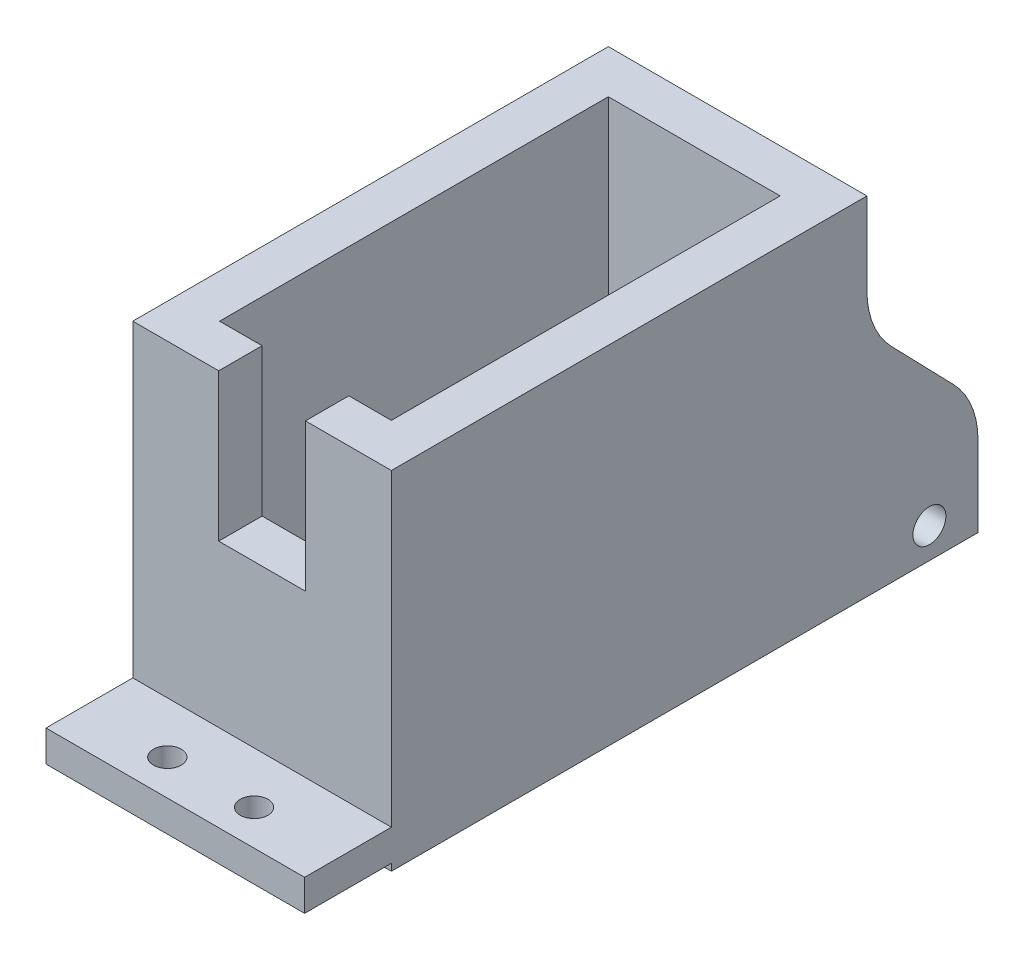
ISO-10303-21;
HEADER;
FILE_DESCRIPTION(('STEP AP214'),'2;1');
FILE_NAME('part.step','',(''),(''),'','','');
FILE_SCHEMA(('AUTOMOTIVE_DESIGN { 1 0 10303 214 1 1 1 1 }'));
ENDSEC;
DATA;
#1=APPLICATION_CONTEXT('core data for automotive mechanical design processes');
#2=APPLICATION_PROTOCOL_DEFINITION('international standard','automotive_design',2000,#1);
#3=PRODUCT_CONTEXT('',#1,'mechanical');
#4=PRODUCT('Part','Part','',(#3));
#5=PRODUCT_RELATED_PRODUCT_CATEGORY('part','',(#4));
#6=PRODUCT_DEFINITION_FORMATION('','',#4);
#7=PRODUCT_DEFINITION_CONTEXT('part definition',#1,'design');
#8=PRODUCT_DEFINITION('design','',#6,#7);
#9=PRODUCT_DEFINITION_SHAPE('','',#8);
#10=(LENGTH_UNIT() NAMED_UNIT(*) SI_UNIT(.MILLI.,.METRE.));
#11=(NAMED_UNIT(*) PLANE_ANGLE_UNIT() SI_UNIT($,.RADIAN.));
#12=(NAMED_UNIT(*) SI_UNIT($,.STERADIAN.) SOLID_ANGLE_UNIT());
#13=UNCERTAINTY_MEASURE_WITH_UNIT(LENGTH_MEASURE(1.E-05),#10,'distance_accuracy_value','');
#14=(GEOMETRIC_REPRESENTATION_CONTEXT(3) GLOBAL_UNCERTAINTY_ASSIGNED_CONTEXT((#13)) GLOBAL_UNIT_ASSIGNED_CONTEXT((#10,
#11,#12)) REPRESENTATION_CONTEXT('',''));
#15=CARTESIAN_POINT('',(0.,0.,0.));
#16=DIRECTION('',(0.,0.,1.));
#17=DIRECTION('',(1.,0.,0.));
#18=AXIS2_PLACEMENT_3D('',#15,#16,#17);
#19=CARTESIAN_POINT('',(0.,50.8,-6.78299136069114));
#20=DIRECTION('',(0.,0.,1.));
#21=DIRECTION('',(1.,0.,0.));
#22=AXIS2_PLACEMENT_3D('',#19,#20,#21);
#23=PLANE('',#22);
#24=DIRECTION('',(0.,-1.,0.));
#25=VECTOR('',#24,1.);
#26=CARTESIAN_POINT('',(30.9678574514039,50.8,-6.78299136069115));
#27=LINE('',#26,#25);
#28=CARTESIAN_POINT('',(30.9678574514039,50.8,-6.78299136069115));
#29=VERTEX_POINT('',#28);
#30=CARTESIAN_POINT('',(30.9678574514039,38.7776741231466,-6.78299136069115));
#31=VERTEX_POINT('',#30);
#32=EDGE_CURVE('E366',#29,#31,#27,.T.);
#33=ORIENTED_EDGE('',*,*,#32,.T.);
#34=DIRECTION('',(1.,0.,0.));
#35=VECTOR('',#34,1.);
#36=CARTESIAN_POINT('',(0.,38.7776741231466,-6.78299136069114));
#37=LINE('',#36,#35);
#38=CARTESIAN_POINT('',(-6.87814254859611,38.7776741231466,-6.78299136069114));
#39=VERTEX_POINT('',#38);
#40=EDGE_CURVE('E61',#31,#39,#37,.F.);
#41=ORIENTED_EDGE('',*,*,#40,.T.);
#42=DIRECTION('',(0.,-1.,0.));
#43=VECTOR('',#42,1.);
#44=CARTESIAN_POINT('',(-6.87814254859611,50.8,-6.78299136069114));
#45=LINE('',#44,#43);
#46=CARTESIAN_POINT('',(-6.87814254859611,50.8,-6.78299136069114));
#47=VERTEX_POINT('',#46);
#48=EDGE_CURVE('E385',#47,#39,#45,.T.);
#49=ORIENTED_EDGE('',*,*,#48,.F.);
#50=DIRECTION('',(-1.,0.,0.));
#51=VECTOR('',#50,1.);
#52=CARTESIAN_POINT('',(0.,50.8,-6.78299136069114));
#53=LINE('',#52,#51);
#54=EDGE_CURVE('E313',#29,#47,#53,.T.);
#55=ORIENTED_EDGE('',*,*,#54,.F.);
#56=EDGE_LOOP('',(#33,#41,#49,#55));
#57=FACE_BOUND('',#56,.T.);
#58=ADVANCED_FACE('F45',(#57),#23,.F.);
#59=CARTESIAN_POINT('',(0.,50.8,62.8130086393089));
#60=DIRECTION('',(0.,0.,-1.));
#61=DIRECTION('',(-1.,0.,0.));
#62=AXIS2_PLACEMENT_3D('',#59,#60,#61);
#63=PLANE('',#62);
#64=DIRECTION('',(1.,0.,0.));
#65=VECTOR('',#64,1.);
#66=CARTESIAN_POINT('',(0.,1.016,62.8130086393089));
#67=LINE('',#66,#65);
#68=CARTESIAN_POINT('',(-6.87814254859611,1.016,62.8130086393089));
#69=VERTEX_POINT('',#68);
#70=CARTESIAN_POINT('',(30.9678574514039,1.016,62.8130086393089));
#71=VERTEX_POINT('',#70);
#72=EDGE_CURVE('E264',#69,#71,#67,.T.);
#73=ORIENTED_EDGE('',*,*,#72,.F.);
#74=DIRECTION('',(0.,-1.,0.));
#75=VECTOR('',#74,1.);
#76=CARTESIAN_POINT('',(-6.8781425485961,50.8,62.8130086393089));
#77=LINE('',#76,#75);
#78=CARTESIAN_POINT('',(-6.8781425485961,0.,62.8130086393089));
#79=VERTEX_POINT('',#78);
#80=EDGE_CURVE('E380',#69,#79,#77,.T.);
#81=ORIENTED_EDGE('',*,*,#80,.T.);
#82=DIRECTION('',(1.,0.,0.));
#83=VECTOR('',#82,1.);
#84=CARTESIAN_POINT('',(0.,0.,62.8130086393089));
#85=LINE('',#84,#83);
#86=CARTESIAN_POINT('',(30.9678574514039,0.,62.8130086393089));
#87=VERTEX_POINT('',#86);
#88=EDGE_CURVE('E211',#79,#87,#85,.T.);
#89=ORIENTED_EDGE('',*,*,#88,.T.);
#90=DIRECTION('',(0.,-1.,0.));
#91=VECTOR('',#90,1.);
#92=CARTESIAN_POINT('',(30.9678574514039,50.8,62.8130086393089));
#93=LINE('',#92,#91);
#94=EDGE_CURVE('E342',#71,#87,#93,.T.);
#95=ORIENTED_EDGE('',*,*,#94,.F.);
#96=EDGE_LOOP('',(#73,#81,#89,#95));
#97=FACE_BOUND('',#96,.T.);
#98=ADVANCED_FACE('F430',(#97),#63,.F.);
#99=CARTESIAN_POINT('',(0.,50.8,-0.432991360691145));
#100=DIRECTION('',(0.,0.,1.));
#101=DIRECTION('',(1.,0.,0.));
#102=AXIS2_PLACEMENT_3D('',#99,#100,#101);
#103=PLANE('',#102);
#104=DIRECTION('',(-1.,0.,0.));
#105=VECTOR('',#104,1.);
#106=CARTESIAN_POINT('',(0.,0.,-0.432991360691145));
#107=LINE('',#106,#105);
#108=CARTESIAN_POINT('',(24.6178574514039,0.,-0.432991360691145));
#109=VERTEX_POINT('',#108);
#110=CARTESIAN_POINT('',(-0.528142548596113,0.,-0.432991360691145));
#111=VERTEX_POINT('',#110);
#112=EDGE_CURVE('E347',#109,#111,#107,.T.);
#113=ORIENTED_EDGE('',*,*,#112,.F.);
#114=DIRECTION('',(0.,-1.,0.));
#115=VECTOR('',#114,1.);
#116=CARTESIAN_POINT('',(24.6178574514039,50.8,-0.432991360691145));
#117=LINE('',#116,#115);
#118=CARTESIAN_POINT('',(24.6178574514039,50.8,-0.432991360691145));
#119=VERTEX_POINT('',#118);
#120=EDGE_CURVE('E372',#119,#109,#117,.T.);
#121=ORIENTED_EDGE('',*,*,#120,.F.);
#122=DIRECTION('',(-1.,0.,0.));
#123=VECTOR('',#122,1.);
#124=CARTESIAN_POINT('',(0.,50.8,-0.432991360691145));
#125=LINE('',#124,#123);
#126=CARTESIAN_POINT('',(-0.528142548596113,50.8,-0.432991360691145));
#127=VERTEX_POINT('',#126);
#128=EDGE_CURVE('E325',#119,#127,#125,.T.);
#129=ORIENTED_EDGE('',*,*,#128,.T.);
#130=DIRECTION('',(0.,-1.,0.));
#131=VECTOR('',#130,1.);
#132=CARTESIAN_POINT('',(-0.528142548596113,50.8,-0.432991360691145));
#133=LINE('',#132,#131);
#134=EDGE_CURVE('E362',#127,#111,#133,.T.);
#135=ORIENTED_EDGE('',*,*,#134,.T.);
#136=EDGE_LOOP('',(#113,#121,#129,#135));
#137=FACE_BOUND('',#136,.T.);
#138=ADVANCED_FACE('F506',(#137),#103,.T.);
#139=CARTESIAN_POINT('',(24.6178574514039,50.8,0.));
#140=DIRECTION('',(-1.,0.,0.));
#141=DIRECTION('',(0.,0.,1.));
#142=AXIS2_PLACEMENT_3D('',#139,#140,#141);
#143=PLANE('',#142);
#144=DIRECTION('',(0.,0.,-1.));
#145=VECTOR('',#144,1.);
#146=CARTESIAN_POINT('',(24.6178574514039,0.,0.));
#147=LINE('',#146,#145);
#148=CARTESIAN_POINT('',(24.6178574514039,0.,56.4630086393089));
#149=VERTEX_POINT('',#148);
#150=EDGE_CURVE('E351',#149,#109,#147,.T.);
#151=ORIENTED_EDGE('',*,*,#150,.F.);
#152=DIRECTION('',(0.,-1.,0.));
#153=VECTOR('',#152,1.);
#154=CARTESIAN_POINT('',(24.6178574514039,50.8,56.4630086393089));
#155=LINE('',#154,#153);
#156=CARTESIAN_POINT('',(24.6178574514039,50.8,56.4630086393089));
#157=VERTEX_POINT('',#156);
#158=EDGE_CURVE('E369',#157,#149,#155,.T.);
#159=ORIENTED_EDGE('',*,*,#158,.F.);
#160=DIRECTION('',(0.,0.,-1.));
#161=VECTOR('',#160,1.);
#162=CARTESIAN_POINT('',(24.6178574514039,50.8,0.));
#163=LINE('',#162,#161);
#164=EDGE_CURVE('E329',#157,#119,#163,.T.);
#165=ORIENTED_EDGE('',*,*,#164,.T.);
#166=ORIENTED_EDGE('',*,*,#120,.T.);
#167=EDGE_LOOP('',(#151,#159,#165,#166));
#168=FACE_BOUND('',#167,.T.);
#169=ADVANCED_FACE('F478',(#168),#143,.T.);
#170=CARTESIAN_POINT('',(0.,50.8,56.4630086393089));
#171=DIRECTION('',(0.,0.,-1.));
#172=DIRECTION('',(-1.,0.,0.));
#173=AXIS2_PLACEMENT_3D('',#170,#171,#172);
#174=PLANE('',#173);
#175=DIRECTION('',(0.,1.,0.));
#176=VECTOR('',#175,1.);
#177=CARTESIAN_POINT('',(5.69485745140389,50.8,56.4630086393089));
#178=LINE('',#177,#176);
#179=CARTESIAN_POINT('',(5.69485745140389,29.21,56.4630086393089));
#180=VERTEX_POINT('',#179);
#181=CARTESIAN_POINT('',(5.69485745140389,50.8,56.4630086393089));
#182=VERTEX_POINT('',#181);
#183=EDGE_CURVE('E303',#180,#182,#178,.T.);
#184=ORIENTED_EDGE('',*,*,#183,.F.);
#185=DIRECTION('',(-1.,0.,0.));
#186=VECTOR('',#185,1.);
#187=CARTESIAN_POINT('',(0.,29.21,56.4630086393089));
#188=LINE('',#187,#186);
#189=CARTESIAN_POINT('',(18.3948574514039,29.21,56.4630086393089));
#190=VERTEX_POINT('',#189);
#191=EDGE_CURVE('E306',#190,#180,#188,.T.);
#192=ORIENTED_EDGE('',*,*,#191,.F.);
#193=DIRECTION('',(0.,-1.,0.));
#194=VECTOR('',#193,1.);
#195=CARTESIAN_POINT('',(18.3948574514039,50.8,56.4630086393089));
#196=LINE('',#195,#194);
#197=CARTESIAN_POINT('',(18.3948574514039,50.8,56.4630086393089));
#198=VERTEX_POINT('',#197);
#199=EDGE_CURVE('E298',#198,#190,#196,.T.);
#200=ORIENTED_EDGE('',*,*,#199,.F.);
#201=DIRECTION('',(1.,0.,0.));
#202=VECTOR('',#201,1.);
#203=CARTESIAN_POINT('',(0.,50.8,56.4630086393089));
#204=LINE('',#203,#202);
#205=EDGE_CURVE('E333',#198,#157,#204,.T.);
#206=ORIENTED_EDGE('',*,*,#205,.T.);
#207=ORIENTED_EDGE('',*,*,#158,.T.);
#208=DIRECTION('',(1.,0.,0.));
#209=VECTOR('',#208,1.);
#210=CARTESIAN_POINT('',(0.,0.,56.4630086393089));
#211=LINE('',#210,#209);
#212=CARTESIAN_POINT('',(-0.528142548596105,0.,56.4630086393089));
#213=VERTEX_POINT('',#212);
#214=EDGE_CURVE('E355',#213,#149,#211,.T.);
#215=ORIENTED_EDGE('',*,*,#214,.F.);
#216=DIRECTION('',(0.,-1.,0.));
#217=VECTOR('',#216,1.);
#218=CARTESIAN_POINT('',(-0.528142548596105,50.8,56.4630086393089));
#219=LINE('',#218,#217);
#220=CARTESIAN_POINT('',(-0.528142548596105,50.8,56.4630086393089));
#221=VERTEX_POINT('',#220);
#222=EDGE_CURVE('E365',#221,#213,#219,.T.);
#223=ORIENTED_EDGE('',*,*,#222,.F.);
#224=EDGE_CURVE('E334',#221,#182,#204,.T.);
#225=ORIENTED_EDGE('',*,*,#224,.T.);
#226=EDGE_LOOP('',(#184,#192,#200,#206,#207,#215,#223,#225));
#227=FACE_BOUND('',#226,.T.);
#228=ADVANCED_FACE('F466',(#227),#174,.T.);
#229=CARTESIAN_POINT('',(30.9678574514039,50.8,0.));
#230=DIRECTION('',(-1.,0.,0.));
#231=DIRECTION('',(0.,0.,1.));
#232=AXIS2_PLACEMENT_3D('',#229,#230,#231);
#233=PLANE('',#232);
#234=DIRECTION('',(0.,1.,0.));
#235=VECTOR('',#234,1.);
#236=CARTESIAN_POINT('',(30.9678574514039,0.,-23.0375141960479));
#237=LINE('',#236,#235);
#238=CARTESIAN_POINT('',(30.9678574514039,0.,-23.0375141960479));
#239=VERTEX_POINT('',#238);
#240=CARTESIAN_POINT('',(30.9678574514039,11.7189346613455,-23.0375141960479));
#241=VERTEX_POINT('',#240);
#242=EDGE_CURVE('E217',#239,#241,#237,.T.);
#243=ORIENTED_EDGE('',*,*,#242,.T.);
#244=CARTESIAN_POINT('',(30.9678574514039,11.7189346613455,-10.3375141960479));
#245=DIRECTION('',(-1.,0.,0.));
#246=DIRECTION('',(0.,0.,1.));
#247=AXIS2_PLACEMENT_3D('',#244,#245,#246);
#248=CIRCLE('',#247,12.7);
#249=CARTESIAN_POINT('',(30.9678574514039,20.5583319402468,-19.4564535941222));
#250=VERTEX_POINT('',#249);
#251=EDGE_CURVE('E398',#241,#250,#248,.F.);
#252=ORIENTED_EDGE('',*,*,#251,.T.);
#253=DIRECTION('',(0.,0.718026724257814,0.696015533771763));
#254=VECTOR('',#253,1.);
#255=CARTESIAN_POINT('',(30.9678574514039,19.6827430072258,-20.3052012493174));
#256=LINE('',#255,#254);
#257=CARTESIAN_POINT('',(30.9678574514039,29.9382768442452,-10.3640519626169));
#258=VERTEX_POINT('',#257);
#259=EDGE_CURVE('E223',#250,#258,#256,.T.);
#260=ORIENTED_EDGE('',*,*,#259,.T.);
#261=CARTESIAN_POINT('',(30.9678574514039,38.7776741231466,-19.4829913606911));
#262=DIRECTION('',(-1.,0.,0.));
#263=DIRECTION('',(0.,0.,1.));
#264=AXIS2_PLACEMENT_3D('',#261,#262,#263);
#265=CIRCLE('',#264,12.7);
#266=EDGE_CURVE('E54',#258,#31,#265,.T.);
#267=ORIENTED_EDGE('',*,*,#266,.T.);
#268=ORIENTED_EDGE('',*,*,#32,.F.);
#269=DIRECTION('',(0.,0.,-1.));
#270=VECTOR('',#269,1.);
#271=CARTESIAN_POINT('',(30.9678574514039,50.8,0.));
#272=LINE('',#271,#270);
#273=CARTESIAN_POINT('',(30.9678574514039,50.8,62.8130086393089));
#274=VERTEX_POINT('',#273);
#275=EDGE_CURVE('E309',#274,#29,#272,.T.);
#276=ORIENTED_EDGE('',*,*,#275,.F.);
#277=CARTESIAN_POINT('',(30.9678574514039,5.588,62.8130086393089));
#278=VERTEX_POINT('',#277);
#279=EDGE_CURVE('E376',#274,#278,#93,.T.);
#280=ORIENTED_EDGE('',*,*,#279,.T.);
#281=DIRECTION('',(0.,0.,1.));
#282=VECTOR('',#281,1.);
#283=CARTESIAN_POINT('',(30.9678574514039,5.588,0.));
#284=LINE('',#283,#282);
#285=CARTESIAN_POINT('',(30.9678574514039,5.588,75.5130086393089));
#286=VERTEX_POINT('',#285);
#287=EDGE_CURVE('E236',#278,#286,#284,.T.);
#288=ORIENTED_EDGE('',*,*,#287,.T.);
#289=DIRECTION('',(0.,-1.,0.));
#290=VECTOR('',#289,1.);
#291=CARTESIAN_POINT('',(30.9678574514039,5.588,75.5130086393089));
#292=LINE('',#291,#290);
#293=CARTESIAN_POINT('',(30.9678574514039,1.016,75.5130086393089));
#294=VERTEX_POINT('',#293);
#295=EDGE_CURVE('E256',#286,#294,#292,.T.);
#296=ORIENTED_EDGE('',*,*,#295,.T.);
#297=DIRECTION('',(0.,0.,1.));
#298=VECTOR('',#297,1.);
#299=CARTESIAN_POINT('',(30.9678574514039,1.016,0.));
#300=LINE('',#299,#298);
#301=EDGE_CURVE('E260',#71,#294,#300,.T.);
#302=ORIENTED_EDGE('',*,*,#301,.F.);
#303=ORIENTED_EDGE('',*,*,#94,.T.);
#304=DIRECTION('',(0.,0.,-1.));
#305=VECTOR('',#304,1.);
#306=CARTESIAN_POINT('',(30.9678574514039,0.,0.));
#307=LINE('',#306,#305);
#308=EDGE_CURVE('E213',#87,#239,#307,.T.);
#309=ORIENTED_EDGE('',*,*,#308,.T.);
#310=EDGE_LOOP('',(#243,#252,#260,#267,#268,#276,#280,#288,#296,#302,#303,#309));
#311=FACE_BOUND('',#310,.T.);
#312=CARTESIAN_POINT('',(30.9678574514039,4.445,-15.9269913606911));
#313=DIRECTION('',(1.,0.,0.));
#314=DIRECTION('',(0.,0.,-1.));
#315=AXIS2_PLACEMENT_3D('',#312,#313,#314);
#316=CIRCLE('',#315,2.413);
#317=CARTESIAN_POINT('',(30.9678574514039,4.445,-18.3399913606911));
#318=VERTEX_POINT('',#317);
#319=EDGE_CURVE('E219',#318,#318,#316,.T.);
#320=ORIENTED_EDGE('',*,*,#319,.F.);
#321=EDGE_LOOP('',(#320));
#322=FACE_BOUND('',#321,.T.);
#323=ADVANCED_FACE('F414',(#311,#322),#233,.F.);
#324=CARTESIAN_POINT('',(-6.87814254859611,50.8,0.));
#325=DIRECTION('',(1.,0.,0.));
#326=DIRECTION('',(0.,0.,-1.));
#327=AXIS2_PLACEMENT_3D('',#324,#325,#326);
#328=PLANE('',#327);
#329=DIRECTION('',(0.,-0.718026724257814,-0.696015533771763));
#330=VECTOR('',#329,1.);
#331=CARTESIAN_POINT('',(-6.87814254859611,19.6827430072258,-20.3052012493174));
#332=LINE('',#331,#330);
#333=CARTESIAN_POINT('',(-6.87814254859611,29.9382768442452,-10.3640519626169));
#334=VERTEX_POINT('',#333);
#335=CARTESIAN_POINT('',(-6.87814254859611,20.5583319402468,-19.4564535941222));
#336=VERTEX_POINT('',#335);
#337=EDGE_CURVE('E201',#334,#336,#332,.T.);
#338=ORIENTED_EDGE('',*,*,#337,.T.);
#339=CARTESIAN_POINT('',(-6.87814254859611,11.7189346613455,-10.3375141960479));
#340=DIRECTION('',(1.,0.,0.));
#341=DIRECTION('',(0.,0.,-1.));
#342=AXIS2_PLACEMENT_3D('',#339,#340,#341);
#343=CIRCLE('',#342,12.7);
#344=CARTESIAN_POINT('',(-6.87814254859611,11.7189346613455,-23.0375141960479));
#345=VERTEX_POINT('',#344);
#346=EDGE_CURVE('E194',#336,#345,#343,.F.);
#347=ORIENTED_EDGE('',*,*,#346,.T.);
#348=DIRECTION('',(0.,-1.,0.));
#349=VECTOR('',#348,1.);
#350=CARTESIAN_POINT('',(-6.87814254859611,0.,-23.0375141960479));
#351=LINE('',#350,#349);
#352=CARTESIAN_POINT('',(-6.87814254859611,0.,-23.0375141960479));
#353=VERTEX_POINT('',#352);
#354=EDGE_CURVE('E186',#345,#353,#351,.T.);
#355=ORIENTED_EDGE('',*,*,#354,.T.);
#356=DIRECTION('',(0.,0.,1.));
#357=VECTOR('',#356,1.);
#358=CARTESIAN_POINT('',(-6.87814254859611,0.,0.));
#359=LINE('',#358,#357);
#360=EDGE_CURVE('E191',#353,#79,#359,.T.);
#361=ORIENTED_EDGE('',*,*,#360,.T.);
#362=ORIENTED_EDGE('',*,*,#80,.F.);
#363=DIRECTION('',(0.,0.,-1.));
#364=VECTOR('',#363,1.);
#365=CARTESIAN_POINT('',(-6.87814254859612,1.016,0.));
#366=LINE('',#365,#364);
#367=CARTESIAN_POINT('',(-6.8781425485961,1.016,75.5130086393089));
#368=VERTEX_POINT('',#367);
#369=EDGE_CURVE('E268',#368,#69,#366,.T.);
#370=ORIENTED_EDGE('',*,*,#369,.F.);
#371=DIRECTION('',(0.,-1.,0.));
#372=VECTOR('',#371,1.);
#373=CARTESIAN_POINT('',(-6.8781425485961,5.588,75.5130086393089));
#374=LINE('',#373,#372);
#375=CARTESIAN_POINT('',(-6.8781425485961,5.588,75.5130086393089));
#376=VERTEX_POINT('',#375);
#377=EDGE_CURVE('E280',#376,#368,#374,.T.);
#378=ORIENTED_EDGE('',*,*,#377,.F.);
#379=DIRECTION('',(0.,0.,-1.));
#380=VECTOR('',#379,1.);
#381=CARTESIAN_POINT('',(-6.87814254859612,5.588,0.));
#382=LINE('',#381,#380);
#383=CARTESIAN_POINT('',(-6.87814254859611,5.588,62.8130086393089));
#384=VERTEX_POINT('',#383);
#385=EDGE_CURVE('E245',#376,#384,#382,.T.);
#386=ORIENTED_EDGE('',*,*,#385,.T.);
#387=CARTESIAN_POINT('',(-6.8781425485961,50.8,62.8130086393089));
#388=VERTEX_POINT('',#387);
#389=EDGE_CURVE('E381',#388,#384,#77,.T.);
#390=ORIENTED_EDGE('',*,*,#389,.F.);
#391=DIRECTION('',(0.,0.,1.));
#392=VECTOR('',#391,1.);
#393=CARTESIAN_POINT('',(-6.87814254859611,50.8,0.));
#394=LINE('',#393,#392);
#395=EDGE_CURVE('E317',#47,#388,#394,.T.);
#396=ORIENTED_EDGE('',*,*,#395,.F.);
#397=ORIENTED_EDGE('',*,*,#48,.T.);
#398=CARTESIAN_POINT('',(-6.87814254859611,38.7776741231466,-19.4829913606911));
#399=DIRECTION('',(1.,0.,0.));
#400=DIRECTION('',(0.,0.,-1.));
#401=AXIS2_PLACEMENT_3D('',#398,#399,#400);
#402=CIRCLE('',#401,12.7);
#403=EDGE_CURVE('E11',#39,#334,#402,.T.);
#404=ORIENTED_EDGE('',*,*,#403,.T.);
#405=EDGE_LOOP('',(#338,#347,#355,#361,#362,#370,#378,#386,#390,#396,#397,#404));
#406=FACE_BOUND('',#405,.T.);
#407=CARTESIAN_POINT('',(-6.87814254859611,4.445,-15.9269913606911));
#408=DIRECTION('',(1.,0.,0.));
#409=DIRECTION('',(0.,0.,-1.));
#410=AXIS2_PLACEMENT_3D('',#407,#408,#409);
#411=CIRCLE('',#410,2.413);
#412=CARTESIAN_POINT('',(-6.87814254859611,4.445,-18.3399913606911));
#413=VERTEX_POINT('',#412);
#414=EDGE_CURVE('E226',#413,#413,#411,.F.);
#415=ORIENTED_EDGE('',*,*,#414,.F.);
#416=EDGE_LOOP('',(#415));
#417=FACE_BOUND('',#416,.T.);
#418=ADVANCED_FACE('F188',(#406,#417),#328,.F.);
#419=ORIENTED_EDGE('',*,*,#389,.T.);
#420=DIRECTION('',(1.,0.,0.));
#421=VECTOR('',#420,1.);
#422=CARTESIAN_POINT('',(0.,5.588,62.8130086393089));
#423=LINE('',#422,#421);
#424=EDGE_CURVE('E241',#384,#278,#423,.T.);
#425=ORIENTED_EDGE('',*,*,#424,.T.);
#426=ORIENTED_EDGE('',*,*,#279,.F.);
#427=DIRECTION('',(1.,0.,0.));
#428=VECTOR('',#427,1.);
#429=CARTESIAN_POINT('',(0.,50.8,62.8130086393089));
#430=LINE('',#429,#428);
#431=CARTESIAN_POINT('',(18.3948574514039,50.8,62.8130086393089));
#432=VERTEX_POINT('',#431);
#433=EDGE_CURVE('E320',#432,#274,#430,.T.);
#434=ORIENTED_EDGE('',*,*,#433,.F.);
#435=DIRECTION('',(0.,1.,0.));
#436=VECTOR('',#435,1.);
#437=CARTESIAN_POINT('',(18.3948574514039,0.,62.8130086393089));
#438=LINE('',#437,#436);
#439=CARTESIAN_POINT('',(18.3948574514039,29.21,62.8130086393089));
#440=VERTEX_POINT('',#439);
#441=EDGE_CURVE('E291',#440,#432,#438,.T.);
#442=ORIENTED_EDGE('',*,*,#441,.F.);
#443=DIRECTION('',(1.,0.,0.));
#444=VECTOR('',#443,1.);
#445=CARTESIAN_POINT('',(0.,29.21,62.8130086393089));
#446=LINE('',#445,#444);
#447=CARTESIAN_POINT('',(5.69485745140389,29.21,62.8130086393089));
#448=VERTEX_POINT('',#447);
#449=EDGE_CURVE('E287',#448,#440,#446,.T.);
#450=ORIENTED_EDGE('',*,*,#449,.F.);
#451=DIRECTION('',(0.,-1.,0.));
#452=VECTOR('',#451,1.);
#453=CARTESIAN_POINT('',(5.6948574514039,0.,62.8130086393089));
#454=LINE('',#453,#452);
#455=CARTESIAN_POINT('',(5.69485745140389,50.8,62.8130086393089));
#456=VERTEX_POINT('',#455);
#457=EDGE_CURVE('E283',#456,#448,#454,.T.);
#458=ORIENTED_EDGE('',*,*,#457,.F.);
#459=EDGE_CURVE('E321',#388,#456,#430,.T.);
#460=ORIENTED_EDGE('',*,*,#459,.F.);
#461=EDGE_LOOP('',(#419,#425,#426,#434,#442,#450,#458,#460));
#462=FACE_BOUND('',#461,.T.);
#463=ADVANCED_FACE('F444',(#462),#63,.F.);
#464=CARTESIAN_POINT('',(-0.528142548596112,50.8,0.));
#465=DIRECTION('',(1.,0.,0.));
#466=DIRECTION('',(0.,0.,-1.));
#467=AXIS2_PLACEMENT_3D('',#464,#465,#466);
#468=PLANE('',#467);
#469=DIRECTION('',(0.,0.,1.));
#470=VECTOR('',#469,1.);
#471=CARTESIAN_POINT('',(-0.528142548596112,0.,0.));
#472=LINE('',#471,#470);
#473=EDGE_CURVE('E314',#111,#213,#472,.T.);
#474=ORIENTED_EDGE('',*,*,#473,.F.);
#475=ORIENTED_EDGE('',*,*,#134,.F.);
#476=DIRECTION('',(0.,0.,1.));
#477=VECTOR('',#476,1.);
#478=CARTESIAN_POINT('',(-0.528142548596112,50.8,0.));
#479=LINE('',#478,#477);
#480=EDGE_CURVE('E338',#127,#221,#479,.T.);
#481=ORIENTED_EDGE('',*,*,#480,.T.);
#482=ORIENTED_EDGE('',*,*,#222,.T.);
#483=EDGE_LOOP('',(#474,#475,#481,#482));
#484=FACE_BOUND('',#483,.T.);
#485=ADVANCED_FACE('F471',(#484),#468,.T.);
#486=CARTESIAN_POINT('',(0.,50.8,0.));
#487=DIRECTION('',(0.,1.,0.));
#488=DIRECTION('',(0.,0.,1.));
#489=AXIS2_PLACEMENT_3D('',#486,#487,#488);
#490=PLANE('',#489);
#491=DIRECTION('',(0.,0.,1.));
#492=VECTOR('',#491,1.);
#493=CARTESIAN_POINT('',(5.69485745140389,50.8,0.));
#494=LINE('',#493,#492);
#495=EDGE_CURVE('E392',#182,#456,#494,.T.);
#496=ORIENTED_EDGE('',*,*,#495,.F.);
#497=ORIENTED_EDGE('',*,*,#224,.F.);
#498=ORIENTED_EDGE('',*,*,#480,.F.);
#499=ORIENTED_EDGE('',*,*,#128,.F.);
#500=ORIENTED_EDGE('',*,*,#164,.F.);
#501=ORIENTED_EDGE('',*,*,#205,.F.);
#502=DIRECTION('',(0.,0.,-1.));
#503=VECTOR('',#502,1.);
#504=CARTESIAN_POINT('',(18.3948574514039,50.8,0.));
#505=LINE('',#504,#503);
#506=EDGE_CURVE('E375',#432,#198,#505,.T.);
#507=ORIENTED_EDGE('',*,*,#506,.F.);
#508=ORIENTED_EDGE('',*,*,#433,.T.);
#509=ORIENTED_EDGE('',*,*,#275,.T.);
#510=ORIENTED_EDGE('',*,*,#54,.T.);
#511=ORIENTED_EDGE('',*,*,#395,.T.);
#512=ORIENTED_EDGE('',*,*,#459,.T.);
#513=EDGE_LOOP('',(#496,#497,#498,#499,#500,#501,#507,#508,#509,#510,#511,#512));
#514=FACE_BOUND('',#513,.T.);
#515=ADVANCED_FACE('F440',(#514),#490,.T.);
#516=CARTESIAN_POINT('',(0.,0.,0.));
#517=DIRECTION('',(0.,1.,0.));
#518=DIRECTION('',(0.,0.,1.));
#519=AXIS2_PLACEMENT_3D('',#516,#517,#518);
#520=PLANE('',#519);
#521=ORIENTED_EDGE('',*,*,#308,.F.);
#522=ORIENTED_EDGE('',*,*,#88,.F.);
#523=ORIENTED_EDGE('',*,*,#360,.F.);
#524=DIRECTION('',(1.,0.,0.));
#525=VECTOR('',#524,1.);
#526=CARTESIAN_POINT('',(-44.2326659279233,0.,-23.0375141960479));
#527=LINE('',#526,#525);
#528=EDGE_CURVE('E208',#353,#239,#527,.T.);
#529=ORIENTED_EDGE('',*,*,#528,.T.);
#530=EDGE_LOOP('',(#521,#522,#523,#529));
#531=FACE_BOUND('',#530,.T.);
#532=ORIENTED_EDGE('',*,*,#112,.T.);
#533=ORIENTED_EDGE('',*,*,#473,.T.);
#534=ORIENTED_EDGE('',*,*,#214,.T.);
#535=ORIENTED_EDGE('',*,*,#150,.T.);
#536=EDGE_LOOP('',(#532,#533,#534,#535));
#537=FACE_BOUND('',#536,.T.);
#538=ADVANCED_FACE('F206',(#531,#537),#520,.F.);
#539=CARTESIAN_POINT('',(5.6948574514039,0.,12.0130086393089));
#540=DIRECTION('',(-1.,0.,0.));
#541=DIRECTION('',(0.,-1.,0.));
#542=AXIS2_PLACEMENT_3D('',#539,#540,#541);
#543=PLANE('',#542);
#544=ORIENTED_EDGE('',*,*,#183,.T.);
#545=ORIENTED_EDGE('',*,*,#495,.T.);
#546=ORIENTED_EDGE('',*,*,#457,.T.);
#547=DIRECTION('',(0.,0.,1.));
#548=VECTOR('',#547,1.);
#549=CARTESIAN_POINT('',(5.69485745140389,29.21,12.0130086393089));
#550=LINE('',#549,#548);
#551=EDGE_CURVE('E294',#180,#448,#550,.T.);
#552=ORIENTED_EDGE('',*,*,#551,.F.);
#553=EDGE_LOOP('',(#544,#545,#546,#552));
#554=FACE_BOUND('',#553,.T.);
#555=ADVANCED_FACE('F487',(#554),#543,.F.);
#556=CARTESIAN_POINT('',(18.3948574514039,0.,12.0130086393089));
#557=DIRECTION('',(1.,0.,0.));
#558=DIRECTION('',(0.,0.,-1.));
#559=AXIS2_PLACEMENT_3D('',#556,#557,#558);
#560=PLANE('',#559);
#561=ORIENTED_EDGE('',*,*,#199,.T.);
#562=DIRECTION('',(0.,0.,1.));
#563=VECTOR('',#562,1.);
#564=CARTESIAN_POINT('',(18.3948574514039,29.21,12.0130086393089));
#565=LINE('',#564,#563);
#566=EDGE_CURVE('E295',#190,#440,#565,.T.);
#567=ORIENTED_EDGE('',*,*,#566,.T.);
#568=ORIENTED_EDGE('',*,*,#441,.T.);
#569=ORIENTED_EDGE('',*,*,#506,.T.);
#570=EDGE_LOOP('',(#561,#567,#568,#569));
#571=FACE_BOUND('',#570,.T.);
#572=ADVANCED_FACE('F483',(#571),#560,.F.);
#573=CARTESIAN_POINT('',(0.,29.21,12.0130086393089));
#574=DIRECTION('',(0.,-1.,0.));
#575=DIRECTION('',(0.,0.,-1.));
#576=AXIS2_PLACEMENT_3D('',#573,#574,#575);
#577=PLANE('',#576);
#578=ORIENTED_EDGE('',*,*,#191,.T.);
#579=ORIENTED_EDGE('',*,*,#551,.T.);
#580=ORIENTED_EDGE('',*,*,#449,.T.);
#581=ORIENTED_EDGE('',*,*,#566,.F.);
#582=EDGE_LOOP('',(#578,#579,#580,#581));
#583=FACE_BOUND('',#582,.T.);
#584=ADVANCED_FACE('F485',(#583),#577,.F.);
#585=CARTESIAN_POINT('',(0.,5.588,75.5130086393089));
#586=DIRECTION('',(0.,0.,-1.));
#587=DIRECTION('',(-1.,0.,0.));
#588=AXIS2_PLACEMENT_3D('',#585,#586,#587);
#589=PLANE('',#588);
#590=DIRECTION('',(1.,0.,0.));
#591=VECTOR('',#590,1.);
#592=CARTESIAN_POINT('',(0.,1.016,75.5130086393089));
#593=LINE('',#592,#591);
#594=EDGE_CURVE('E271',#368,#294,#593,.T.);
#595=ORIENTED_EDGE('',*,*,#594,.T.);
#596=ORIENTED_EDGE('',*,*,#295,.F.);
#597=DIRECTION('',(1.,0.,0.));
#598=VECTOR('',#597,1.);
#599=CARTESIAN_POINT('',(0.,5.588,75.5130086393089));
#600=LINE('',#599,#598);
#601=EDGE_CURVE('E249',#376,#286,#600,.T.);
#602=ORIENTED_EDGE('',*,*,#601,.F.);
#603=ORIENTED_EDGE('',*,*,#377,.T.);
#604=EDGE_LOOP('',(#595,#596,#602,#603));
#605=FACE_BOUND('',#604,.T.);
#606=ADVANCED_FACE('F452',(#605),#589,.F.);
#607=CARTESIAN_POINT('',(18.3948574514039,5.588,70.3328216174859));
#608=DIRECTION('',(0.,-1.,0.));
#609=DIRECTION('',(0.,0.,-1.));
#610=AXIS2_PLACEMENT_3D('',#607,#608,#609);
#611=CYLINDRICAL_SURFACE('',#610,2.03200000000001);
#612=CARTESIAN_POINT('',(18.3948574514039,5.588,70.3328216174859));
#613=DIRECTION('',(0.,1.,0.));
#614=DIRECTION('',(0.,0.,1.));
#615=AXIS2_PLACEMENT_3D('',#612,#613,#614);
#616=CIRCLE('',#615,2.03200000000001);
#617=CARTESIAN_POINT('',(18.3948574514039,5.588,72.3648216174859));
#618=VERTEX_POINT('',#617);
#619=EDGE_CURVE('E232',#618,#618,#616,.F.);
#620=ORIENTED_EDGE('',*,*,#619,.F.);
#621=EDGE_LOOP('',(#620));
#622=FACE_BOUND('',#621,.T.);
#623=CARTESIAN_POINT('',(18.3948574514039,1.016,70.3328216174859));
#624=DIRECTION('',(0.,1.,0.));
#625=DIRECTION('',(0.,0.,1.));
#626=AXIS2_PLACEMENT_3D('',#623,#624,#625);
#627=CIRCLE('',#626,2.03200000000001);
#628=CARTESIAN_POINT('',(18.3948574514039,1.016,72.3648216174859));
#629=VERTEX_POINT('',#628);
#630=EDGE_CURVE('E200',#629,#629,#627,.F.);
#631=ORIENTED_EDGE('',*,*,#630,.T.);
#632=EDGE_LOOP('',(#631));
#633=FACE_BOUND('',#632,.T.);
#634=ADVANCED_FACE('F535',(#622,#633),#611,.F.);
#635=CARTESIAN_POINT('',(5.69485745140389,5.588,70.3328216174859));
#636=DIRECTION('',(0.,-1.,0.));
#637=DIRECTION('',(0.,0.,-1.));
#638=AXIS2_PLACEMENT_3D('',#635,#636,#637);
#639=CYLINDRICAL_SURFACE('',#638,2.03200000000001);
#640=CARTESIAN_POINT('',(5.69485745140389,5.588,70.3328216174859));
#641=DIRECTION('',(0.,1.,0.));
#642=DIRECTION('',(0.,0.,1.));
#643=AXIS2_PLACEMENT_3D('',#640,#641,#642);
#644=CIRCLE('',#643,2.03200000000001);
#645=CARTESIAN_POINT('',(5.69485745140389,5.588,72.3648216174859));
#646=VERTEX_POINT('',#645);
#647=EDGE_CURVE('E252',#646,#646,#644,.F.);
#648=ORIENTED_EDGE('',*,*,#647,.F.);
#649=EDGE_LOOP('',(#648));
#650=FACE_BOUND('',#649,.T.);
#651=CARTESIAN_POINT('',(5.69485745140389,1.016,70.3328216174859));
#652=DIRECTION('',(0.,1.,0.));
#653=DIRECTION('',(0.,0.,1.));
#654=AXIS2_PLACEMENT_3D('',#651,#652,#653);
#655=CIRCLE('',#654,2.03200000000001);
#656=CARTESIAN_POINT('',(5.69485745140389,1.016,72.3648216174859));
#657=VERTEX_POINT('',#656);
#658=EDGE_CURVE('E237',#657,#657,#655,.F.);
#659=ORIENTED_EDGE('',*,*,#658,.T.);
#660=EDGE_LOOP('',(#659));
#661=FACE_BOUND('',#660,.T.);
#662=ADVANCED_FACE('F528',(#650,#661),#639,.F.);
#663=CARTESIAN_POINT('',(0.,5.588,0.));
#664=DIRECTION('',(0.,1.,0.));
#665=DIRECTION('',(0.,0.,1.));
#666=AXIS2_PLACEMENT_3D('',#663,#664,#665);
#667=PLANE('',#666);
#668=ORIENTED_EDGE('',*,*,#619,.T.);
#669=EDGE_LOOP('',(#668));
#670=FACE_BOUND('',#669,.T.);
#671=ORIENTED_EDGE('',*,*,#287,.F.);
#672=ORIENTED_EDGE('',*,*,#424,.F.);
#673=ORIENTED_EDGE('',*,*,#385,.F.);
#674=ORIENTED_EDGE('',*,*,#601,.T.);
#675=EDGE_LOOP('',(#671,#672,#673,#674));
#676=FACE_BOUND('',#675,.T.);
#677=ORIENTED_EDGE('',*,*,#647,.T.);
#678=EDGE_LOOP('',(#677));
#679=FACE_BOUND('',#678,.T.);
#680=ADVANCED_FACE('F447',(#670,#676,#679),#667,.T.);
#681=CARTESIAN_POINT('',(0.,1.016,0.));
#682=DIRECTION('',(0.,1.,0.));
#683=DIRECTION('',(0.,0.,1.));
#684=AXIS2_PLACEMENT_3D('',#681,#682,#683);
#685=PLANE('',#684);
#686=ORIENTED_EDGE('',*,*,#630,.F.);
#687=EDGE_LOOP('',(#686));
#688=FACE_BOUND('',#687,.T.);
#689=ORIENTED_EDGE('',*,*,#301,.T.);
#690=ORIENTED_EDGE('',*,*,#594,.F.);
#691=ORIENTED_EDGE('',*,*,#369,.T.);
#692=ORIENTED_EDGE('',*,*,#72,.T.);
#693=EDGE_LOOP('',(#689,#690,#691,#692));
#694=FACE_BOUND('',#693,.T.);
#695=ORIENTED_EDGE('',*,*,#658,.F.);
#696=EDGE_LOOP('',(#695));
#697=FACE_BOUND('',#696,.T.);
#698=ADVANCED_FACE('F455',(#688,#694,#697),#685,.F.);
#699=CARTESIAN_POINT('',(-44.2326659279233,19.6827430072258,-20.3052012493174));
#700=DIRECTION('',(0.,0.696015533771763,-0.718026724257814));
#701=DIRECTION('',(0.,0.718026724257814,0.696015533771763));
#702=AXIS2_PLACEMENT_3D('',#699,#700,#701);
#703=PLANE('',#702);
#704=ORIENTED_EDGE('',*,*,#259,.F.);
#705=DIRECTION('',(1.,0.,0.));
#706=VECTOR('',#705,1.);
#707=CARTESIAN_POINT('',(-44.2326659279233,20.5583319402468,-19.4564535941222));
#708=LINE('',#707,#706);
#709=EDGE_CURVE('E69',#250,#336,#708,.F.);
#710=ORIENTED_EDGE('',*,*,#709,.T.);
#711=ORIENTED_EDGE('',*,*,#337,.F.);
#712=DIRECTION('',(1.,0.,0.));
#713=VECTOR('',#712,1.);
#714=CARTESIAN_POINT('',(-44.2326659279233,29.9382768442452,-10.3640519626169));
#715=LINE('',#714,#713);
#716=EDGE_CURVE('E401',#334,#258,#715,.T.);
#717=ORIENTED_EDGE('',*,*,#716,.T.);
#718=EDGE_LOOP('',(#704,#710,#711,#717));
#719=FACE_BOUND('',#718,.T.);
#720=ADVANCED_FACE('F421',(#719),#703,.T.);
#721=CARTESIAN_POINT('',(-44.2326659279233,0.,-23.0375141960479));
#722=DIRECTION('',(0.,0.,-1.));
#723=DIRECTION('',(-1.,0.,0.));
#724=AXIS2_PLACEMENT_3D('',#721,#722,#723);
#725=PLANE('',#724);
#726=ORIENTED_EDGE('',*,*,#354,.F.);
#727=DIRECTION('',(1.,0.,0.));
#728=VECTOR('',#727,1.);
#729=CARTESIAN_POINT('',(-44.2326659279233,11.7189346613455,-23.0375141960479));
#730=LINE('',#729,#728);
#731=EDGE_CURVE('E395',#345,#241,#730,.T.);
#732=ORIENTED_EDGE('',*,*,#731,.T.);
#733=ORIENTED_EDGE('',*,*,#242,.F.);
#734=ORIENTED_EDGE('',*,*,#528,.F.);
#735=EDGE_LOOP('',(#726,#732,#733,#734));
#736=FACE_BOUND('',#735,.T.);
#737=ADVANCED_FACE('F215',(#736),#725,.T.);
#738=CARTESIAN_POINT('',(-44.2326659279233,4.445,-15.9269913606911));
#739=DIRECTION('',(1.,0.,0.));
#740=DIRECTION('',(0.,0.,-1.));
#741=AXIS2_PLACEMENT_3D('',#738,#739,#740);
#742=CYLINDRICAL_SURFACE('',#741,2.413);
#743=ORIENTED_EDGE('',*,*,#414,.T.);
#744=EDGE_LOOP('',(#743));
#745=FACE_BOUND('',#744,.T.);
#746=ORIENTED_EDGE('',*,*,#319,.T.);
#747=EDGE_LOOP('',(#746));
#748=FACE_BOUND('',#747,.T.);
#749=ADVANCED_FACE('F511',(#745,#748),#742,.F.);
#750=CARTESIAN_POINT('',(-44.2326659279233,11.7189346613455,-10.3375141960479));
#751=DIRECTION('',(1.,0.,0.));
#752=DIRECTION('',(0.,0.,-1.));
#753=AXIS2_PLACEMENT_3D('',#750,#751,#752);
#754=CYLINDRICAL_SURFACE('',#753,12.7);
#755=ORIENTED_EDGE('',*,*,#346,.F.);
#756=ORIENTED_EDGE('',*,*,#709,.F.);
#757=ORIENTED_EDGE('',*,*,#251,.F.);
#758=ORIENTED_EDGE('',*,*,#731,.F.);
#759=EDGE_LOOP('',(#755,#756,#757,#758));
#760=FACE_BOUND('',#759,.T.);
#761=ADVANCED_FACE('F425',(#760),#754,.T.);
#762=CARTESIAN_POINT('',(-44.2326659279233,38.7776741231466,-19.4829913606911));
#763=DIRECTION('',(1.,0.,0.));
#764=DIRECTION('',(0.,1.,0.));
#765=AXIS2_PLACEMENT_3D('',#762,#763,#764);
#766=CYLINDRICAL_SURFACE('',#765,12.7);
#767=ORIENTED_EDGE('',*,*,#403,.F.);
#768=ORIENTED_EDGE('',*,*,#40,.F.);
#769=ORIENTED_EDGE('',*,*,#266,.F.);
#770=ORIENTED_EDGE('',*,*,#716,.F.);
#771=EDGE_LOOP('',(#767,#768,#769,#770));
#772=FACE_BOUND('',#771,.T.);
#773=ADVANCED_FACE('F47',(#772),#766,.F.);
#774=CLOSED_SHELL('',(#58,#98,#138,#169,#228,#323,#418,#463,#485,#515,#538,#555,#572,#584,#606,
#634,#662,#680,#698,#720,#737,#749,#761,#773));
#775=MANIFOLD_SOLID_BREP('B2',#774);
#776=ADVANCED_BREP_SHAPE_REPRESENTATION('',(#18,#775),#14);
#777=SHAPE_DEFINITION_REPRESENTATION(#9,#776);
ENDSEC;
END-ISO-10303-21;
